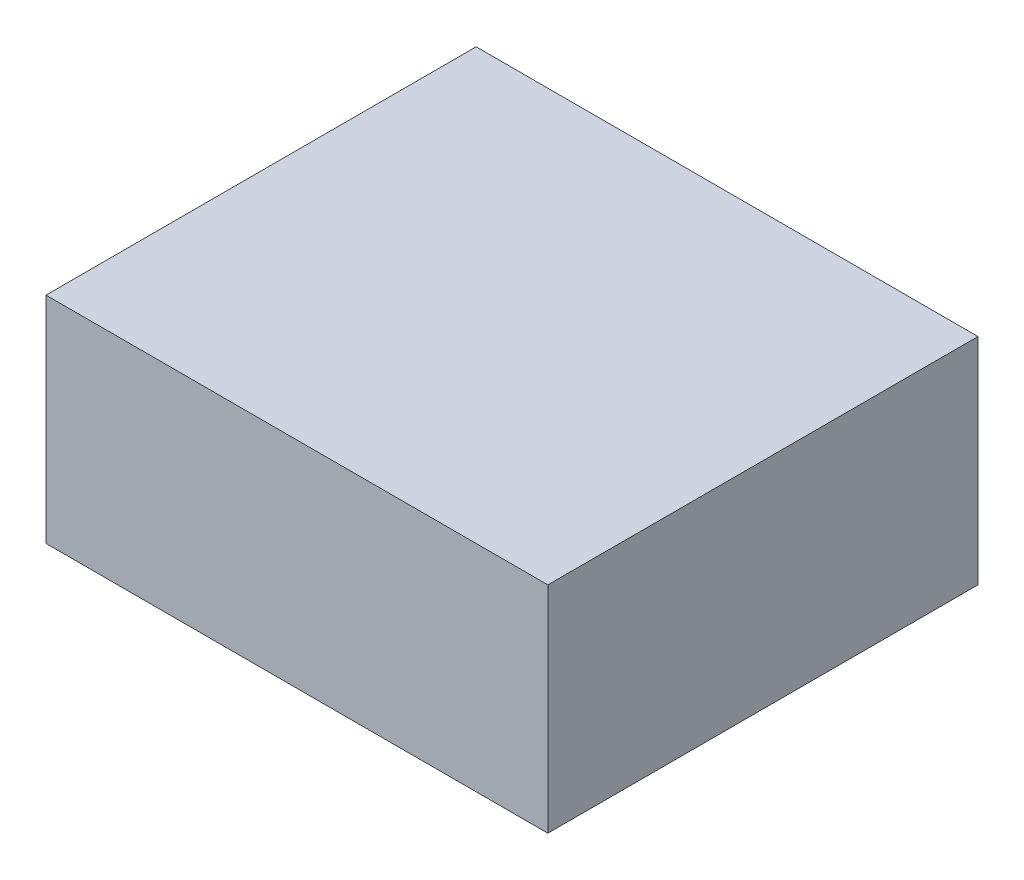
ISO-10303-21;
HEADER;
FILE_DESCRIPTION(('STEP AP214'),'2;1');
FILE_NAME('part.step','',(''),(''),'','','');
FILE_SCHEMA(('AUTOMOTIVE_DESIGN { 1 0 10303 214 1 1 1 1 }'));
ENDSEC;
DATA;
#1=APPLICATION_CONTEXT('core data for automotive mechanical design processes');
#2=APPLICATION_PROTOCOL_DEFINITION('international standard','automotive_design',2000,#1);
#3=PRODUCT_CONTEXT('',#1,'mechanical');
#4=PRODUCT('Part','Part','',(#3));
#5=PRODUCT_RELATED_PRODUCT_CATEGORY('part','',(#4));
#6=PRODUCT_DEFINITION_FORMATION('','',#4);
#7=PRODUCT_DEFINITION_CONTEXT('part definition',#1,'design');
#8=PRODUCT_DEFINITION('design','',#6,#7);
#9=PRODUCT_DEFINITION_SHAPE('','',#8);
#10=(LENGTH_UNIT() NAMED_UNIT(*) SI_UNIT(.MILLI.,.METRE.));
#11=(NAMED_UNIT(*) PLANE_ANGLE_UNIT() SI_UNIT($,.RADIAN.));
#12=(NAMED_UNIT(*) SI_UNIT($,.STERADIAN.) SOLID_ANGLE_UNIT());
#13=UNCERTAINTY_MEASURE_WITH_UNIT(LENGTH_MEASURE(1.E-05),#10,'distance_accuracy_value','');
#14=(GEOMETRIC_REPRESENTATION_CONTEXT(3) GLOBAL_UNCERTAINTY_ASSIGNED_CONTEXT((#13)) GLOBAL_UNIT_ASSIGNED_CONTEXT((#10,
#11,#12)) REPRESENTATION_CONTEXT('',''));
#15=CARTESIAN_POINT('',(0.,0.,0.));
#16=DIRECTION('',(0.,0.,1.));
#17=DIRECTION('',(1.,0.,0.));
#18=AXIS2_PLACEMENT_3D('',#15,#16,#17);
#19=CARTESIAN_POINT('',(-35.,30.,-30.));
#20=DIRECTION('',(1.,0.,0.));
#21=DIRECTION('',(0.,0.,-1.));
#22=AXIS2_PLACEMENT_3D('',#19,#20,#21);
#23=PLANE('',#22);
#24=DIRECTION('',(0.,0.,1.));
#25=VECTOR('',#24,1.);
#26=CARTESIAN_POINT('',(-35.,0.,-30.));
#27=LINE('',#26,#25);
#28=CARTESIAN_POINT('',(-35.,0.,-30.));
#29=VERTEX_POINT('',#28);
#30=CARTESIAN_POINT('',(-35.,0.,30.));
#31=VERTEX_POINT('',#30);
#32=EDGE_CURVE('E98',#29,#31,#27,.T.);
#33=ORIENTED_EDGE('',*,*,#32,.T.);
#34=DIRECTION('',(0.,-1.,0.));
#35=VECTOR('',#34,1.);
#36=CARTESIAN_POINT('',(-35.,30.,30.));
#37=LINE('',#36,#35);
#38=CARTESIAN_POINT('',(-35.,30.,30.));
#39=VERTEX_POINT('',#38);
#40=EDGE_CURVE('E11',#39,#31,#37,.T.);
#41=ORIENTED_EDGE('',*,*,#40,.F.);
#42=DIRECTION('',(0.,0.,1.));
#43=VECTOR('',#42,1.);
#44=CARTESIAN_POINT('',(-35.,30.,-30.));
#45=LINE('',#44,#43);
#46=CARTESIAN_POINT('',(-35.,30.,-30.));
#47=VERTEX_POINT('',#46);
#48=EDGE_CURVE('E86',#47,#39,#45,.T.);
#49=ORIENTED_EDGE('',*,*,#48,.F.);
#50=DIRECTION('',(0.,-1.,0.));
#51=VECTOR('',#50,1.);
#52=CARTESIAN_POINT('',(-35.,30.,-30.));
#53=LINE('',#52,#51);
#54=EDGE_CURVE('E94',#47,#29,#53,.T.);
#55=ORIENTED_EDGE('',*,*,#54,.T.);
#56=EDGE_LOOP('',(#33,#41,#49,#55));
#57=FACE_BOUND('',#56,.T.);
#58=ADVANCED_FACE('F35',(#57),#23,.F.);
#59=CARTESIAN_POINT('',(-35.,30.,30.));
#60=DIRECTION('',(0.,0.,-1.));
#61=DIRECTION('',(-1.,0.,0.));
#62=AXIS2_PLACEMENT_3D('',#59,#60,#61);
#63=PLANE('',#62);
#64=DIRECTION('',(1.,0.,0.));
#65=VECTOR('',#64,1.);
#66=CARTESIAN_POINT('',(-35.,0.,30.));
#67=LINE('',#66,#65);
#68=CARTESIAN_POINT('',(35.,0.,30.));
#69=VERTEX_POINT('',#68);
#70=EDGE_CURVE('E90',#31,#69,#67,.T.);
#71=ORIENTED_EDGE('',*,*,#70,.T.);
#72=DIRECTION('',(0.,-1.,0.));
#73=VECTOR('',#72,1.);
#74=CARTESIAN_POINT('',(35.,30.,30.));
#75=LINE('',#74,#73);
#76=CARTESIAN_POINT('',(35.,30.,30.));
#77=VERTEX_POINT('',#76);
#78=EDGE_CURVE('E43',#77,#69,#75,.T.);
#79=ORIENTED_EDGE('',*,*,#78,.F.);
#80=DIRECTION('',(1.,0.,0.));
#81=VECTOR('',#80,1.);
#82=CARTESIAN_POINT('',(-35.,30.,30.));
#83=LINE('',#82,#81);
#84=EDGE_CURVE('E81',#39,#77,#83,.T.);
#85=ORIENTED_EDGE('',*,*,#84,.F.);
#86=ORIENTED_EDGE('',*,*,#40,.T.);
#87=EDGE_LOOP('',(#71,#79,#85,#86));
#88=FACE_BOUND('',#87,.T.);
#89=ADVANCED_FACE('F89',(#88),#63,.F.);
#90=CARTESIAN_POINT('',(35.,30.,-30.));
#91=DIRECTION('',(-1.,0.,0.));
#92=DIRECTION('',(0.,0.,1.));
#93=AXIS2_PLACEMENT_3D('',#90,#91,#92);
#94=PLANE('',#93);
#95=DIRECTION('',(0.,0.,-1.));
#96=VECTOR('',#95,1.);
#97=CARTESIAN_POINT('',(35.,0.,-30.));
#98=LINE('',#97,#96);
#99=CARTESIAN_POINT('',(35.,0.,-30.));
#100=VERTEX_POINT('',#99);
#101=EDGE_CURVE('E68',#69,#100,#98,.T.);
#102=ORIENTED_EDGE('',*,*,#101,.T.);
#103=DIRECTION('',(0.,-1.,0.));
#104=VECTOR('',#103,1.);
#105=CARTESIAN_POINT('',(35.,30.,-30.));
#106=LINE('',#105,#104);
#107=CARTESIAN_POINT('',(35.,30.,-30.));
#108=VERTEX_POINT('',#107);
#109=EDGE_CURVE('E91',#108,#100,#106,.T.);
#110=ORIENTED_EDGE('',*,*,#109,.F.);
#111=DIRECTION('',(0.,0.,-1.));
#112=VECTOR('',#111,1.);
#113=CARTESIAN_POINT('',(35.,30.,-30.));
#114=LINE('',#113,#112);
#115=EDGE_CURVE('E84',#77,#108,#114,.T.);
#116=ORIENTED_EDGE('',*,*,#115,.F.);
#117=ORIENTED_EDGE('',*,*,#78,.T.);
#118=EDGE_LOOP('',(#102,#110,#116,#117));
#119=FACE_BOUND('',#118,.T.);
#120=ADVANCED_FACE('F92',(#119),#94,.F.);
#121=CARTESIAN_POINT('',(-35.,30.,-30.));
#122=DIRECTION('',(0.,0.,1.));
#123=DIRECTION('',(1.,0.,0.));
#124=AXIS2_PLACEMENT_3D('',#121,#122,#123);
#125=PLANE('',#124);
#126=DIRECTION('',(-1.,0.,0.));
#127=VECTOR('',#126,1.);
#128=CARTESIAN_POINT('',(-35.,0.,-30.));
#129=LINE('',#128,#127);
#130=EDGE_CURVE('E74',#100,#29,#129,.T.);
#131=ORIENTED_EDGE('',*,*,#130,.T.);
#132=ORIENTED_EDGE('',*,*,#54,.F.);
#133=DIRECTION('',(-1.,0.,0.));
#134=VECTOR('',#133,1.);
#135=CARTESIAN_POINT('',(-35.,30.,-30.));
#136=LINE('',#135,#134);
#137=EDGE_CURVE('E51',#108,#47,#136,.T.);
#138=ORIENTED_EDGE('',*,*,#137,.F.);
#139=ORIENTED_EDGE('',*,*,#109,.T.);
#140=EDGE_LOOP('',(#131,#132,#138,#139));
#141=FACE_BOUND('',#140,.T.);
#142=ADVANCED_FACE('F105',(#141),#125,.F.);
#143=CARTESIAN_POINT('',(0.,30.,0.));
#144=DIRECTION('',(0.,1.,0.));
#145=DIRECTION('',(0.,0.,1.));
#146=AXIS2_PLACEMENT_3D('',#143,#144,#145);
#147=PLANE('',#146);
#148=ORIENTED_EDGE('',*,*,#48,.T.);
#149=ORIENTED_EDGE('',*,*,#84,.T.);
#150=ORIENTED_EDGE('',*,*,#115,.T.);
#151=ORIENTED_EDGE('',*,*,#137,.T.);
#152=EDGE_LOOP('',(#148,#149,#150,#151));
#153=FACE_BOUND('',#152,.T.);
#154=ADVANCED_FACE('F82',(#153),#147,.T.);
#155=CARTESIAN_POINT('',(0.,0.,0.));
#156=DIRECTION('',(0.,1.,0.));
#157=DIRECTION('',(0.,0.,1.));
#158=AXIS2_PLACEMENT_3D('',#155,#156,#157);
#159=PLANE('',#158);
#160=ORIENTED_EDGE('',*,*,#32,.F.);
#161=ORIENTED_EDGE('',*,*,#130,.F.);
#162=ORIENTED_EDGE('',*,*,#101,.F.);
#163=ORIENTED_EDGE('',*,*,#70,.F.);
#164=EDGE_LOOP('',(#160,#161,#162,#163));
#165=FACE_BOUND('',#164,.T.);
#166=ADVANCED_FACE('F108',(#165),#159,.F.);
#167=CLOSED_SHELL('',(#58,#89,#120,#142,#154,#166));
#168=MANIFOLD_SOLID_BREP('B2',#167);
#169=ADVANCED_BREP_SHAPE_REPRESENTATION('',(#18,#168),#14);
#170=SHAPE_DEFINITION_REPRESENTATION(#9,#169);
ENDSEC;
END-ISO-10303-21;
